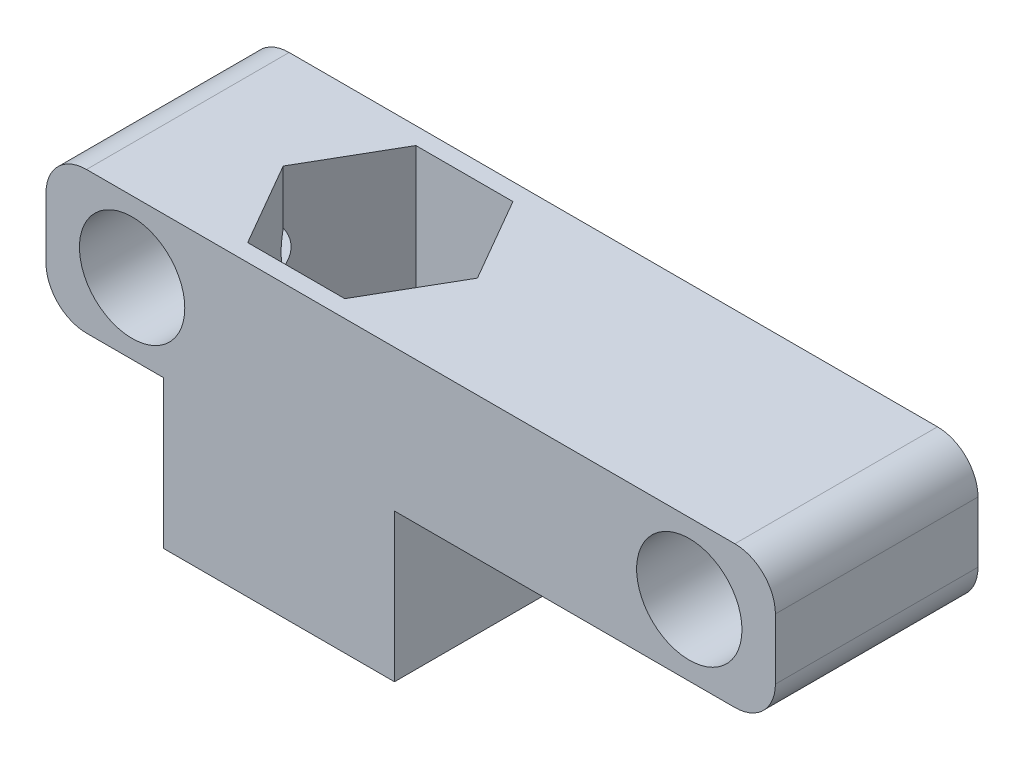
ISO-10303-21;
HEADER;
FILE_DESCRIPTION(('STEP AP214'),'2;1');
FILE_NAME('part.step','',(''),(''),'','','');
FILE_SCHEMA(('AUTOMOTIVE_DESIGN { 1 0 10303 214 1 1 1 1 }'));
ENDSEC;
DATA;
#1=APPLICATION_CONTEXT('core data for automotive mechanical design processes');
#2=APPLICATION_PROTOCOL_DEFINITION('international standard','automotive_design',2000,#1);
#3=PRODUCT_CONTEXT('',#1,'mechanical');
#4=PRODUCT('Part','Part','',(#3));
#5=PRODUCT_RELATED_PRODUCT_CATEGORY('part','',(#4));
#6=PRODUCT_DEFINITION_FORMATION('','',#4);
#7=PRODUCT_DEFINITION_CONTEXT('part definition',#1,'design');
#8=PRODUCT_DEFINITION('design','',#6,#7);
#9=PRODUCT_DEFINITION_SHAPE('','',#8);
#10=(LENGTH_UNIT() NAMED_UNIT(*) SI_UNIT(.MILLI.,.METRE.));
#11=(NAMED_UNIT(*) PLANE_ANGLE_UNIT() SI_UNIT($,.RADIAN.));
#12=(NAMED_UNIT(*) SI_UNIT($,.STERADIAN.) SOLID_ANGLE_UNIT());
#13=UNCERTAINTY_MEASURE_WITH_UNIT(LENGTH_MEASURE(1.E-05),#10,'distance_accuracy_value','');
#14=(GEOMETRIC_REPRESENTATION_CONTEXT(3) GLOBAL_UNCERTAINTY_ASSIGNED_CONTEXT((#13)) GLOBAL_UNIT_ASSIGNED_CONTEXT((#10,
#11,#12)) REPRESENTATION_CONTEXT('',''));
#15=CARTESIAN_POINT('',(0.,0.,0.));
#16=DIRECTION('',(0.,0.,1.));
#17=DIRECTION('',(1.,0.,0.));
#18=AXIS2_PLACEMENT_3D('',#15,#16,#17);
#19=CARTESIAN_POINT('',(-46.016694490818,8.8780487804878,10.));
#20=DIRECTION('',(0.,1.,0.));
#21=DIRECTION('',(0.,0.,1.));
#22=AXIS2_PLACEMENT_3D('',#19,#20,#21);
#23=PLANE('',#22);
#24=DIRECTION('',(1.,0.,0.));
#25=VECTOR('',#24,1.);
#26=CARTESIAN_POINT('',(-46.016694490818,8.8780487804878,10.));
#27=LINE('',#26,#25);
#28=CARTESIAN_POINT('',(-44.016694490818,8.8780487804878,10.));
#29=VERTEX_POINT('',#28);
#30=CARTESIAN_POINT('',(-40.216694490818,8.8780487804878,10.));
#31=VERTEX_POINT('',#30);
#32=EDGE_CURVE('E264',#29,#31,#27,.T.);
#33=ORIENTED_EDGE('',*,*,#32,.F.);
#34=DIRECTION('',(0.,0.,-1.));
#35=VECTOR('',#34,1.);
#36=CARTESIAN_POINT('',(-44.016694490818,8.8780487804878,10.));
#37=LINE('',#36,#35);
#38=CARTESIAN_POINT('',(-44.016694490818,8.8780487804878,0.));
#39=VERTEX_POINT('',#38);
#40=EDGE_CURVE('E286',#29,#39,#37,.T.);
#41=ORIENTED_EDGE('',*,*,#40,.T.);
#42=DIRECTION('',(1.,0.,0.));
#43=VECTOR('',#42,1.);
#44=CARTESIAN_POINT('',(-46.016694490818,8.8780487804878,0.));
#45=LINE('',#44,#43);
#46=CARTESIAN_POINT('',(-40.216694490818,8.8780487804878,0.));
#47=VERTEX_POINT('',#46);
#48=EDGE_CURVE('E244',#39,#47,#45,.T.);
#49=ORIENTED_EDGE('',*,*,#48,.T.);
#50=DIRECTION('',(0.,0.,-1.));
#51=VECTOR('',#50,1.);
#52=CARTESIAN_POINT('',(-40.216694490818,8.8780487804878,10.));
#53=LINE('',#52,#51);
#54=EDGE_CURVE('E173',#31,#47,#53,.T.);
#55=ORIENTED_EDGE('',*,*,#54,.F.);
#56=EDGE_LOOP('',(#33,#41,#49,#55));
#57=FACE_BOUND('',#56,.T.);
#58=ADVANCED_FACE('F33',(#57),#23,.F.);
#59=CARTESIAN_POINT('',(-28.816694490818,8.8780487804878,0.));
#60=VERTEX_POINT('',#59);
#61=CARTESIAN_POINT('',(-12.016694490818,8.8780487804878,0.));
#62=VERTEX_POINT('',#61);
#63=EDGE_CURVE('E248',#60,#62,#45,.T.);
#64=ORIENTED_EDGE('',*,*,#63,.T.);
#65=DIRECTION('',(0.,0.,-1.));
#66=VECTOR('',#65,1.);
#67=CARTESIAN_POINT('',(-12.016694490818,8.8780487804878,10.));
#68=LINE('',#67,#66);
#69=CARTESIAN_POINT('',(-12.016694490818,8.8780487804878,10.));
#70=VERTEX_POINT('',#69);
#71=EDGE_CURVE('E48',#62,#70,#68,.F.);
#72=ORIENTED_EDGE('',*,*,#71,.T.);
#73=CARTESIAN_POINT('',(-28.816694490818,8.8780487804878,10.));
#74=VERTEX_POINT('',#73);
#75=EDGE_CURVE('E261',#74,#70,#27,.T.);
#76=ORIENTED_EDGE('',*,*,#75,.F.);
#77=DIRECTION('',(0.,0.,1.));
#78=VECTOR('',#77,1.);
#79=CARTESIAN_POINT('',(-28.816694490818,8.8780487804878,10.));
#80=LINE('',#79,#78);
#81=EDGE_CURVE('E230',#60,#74,#80,.T.);
#82=ORIENTED_EDGE('',*,*,#81,.F.);
#83=EDGE_LOOP('',(#64,#72,#76,#82));
#84=FACE_BOUND('',#83,.T.);
#85=ADVANCED_FACE('F402',(#84),#23,.F.);
#86=CARTESIAN_POINT('',(0.,0.,10.));
#87=DIRECTION('',(0.,0.,1.));
#88=DIRECTION('',(1.,0.,0.));
#89=AXIS2_PLACEMENT_3D('',#86,#87,#88);
#90=PLANE('',#89);
#91=CARTESIAN_POINT('',(-41.766694490818,12.3780487804878,10.));
#92=DIRECTION('',(0.,0.,1.));
#93=DIRECTION('',(1.,0.,0.));
#94=AXIS2_PLACEMENT_3D('',#91,#92,#93);
#95=CIRCLE('',#94,2.6);
#96=CARTESIAN_POINT('',(-39.166694490818,12.3780487804878,10.));
#97=VERTEX_POINT('',#96);
#98=EDGE_CURVE('E300',#97,#97,#95,.T.);
#99=ORIENTED_EDGE('',*,*,#98,.F.);
#100=EDGE_LOOP('',(#99));
#101=FACE_BOUND('',#100,.T.);
#102=DIRECTION('',(0.,1.,0.));
#103=VECTOR('',#102,1.);
#104=CARTESIAN_POINT('',(-10.016694490818,15.8780487804878,10.));
#105=LINE('',#104,#103);
#106=CARTESIAN_POINT('',(-10.016694490818,10.8780487804878,10.));
#107=VERTEX_POINT('',#106);
#108=CARTESIAN_POINT('',(-10.016694490818,13.8780487804878,10.));
#109=VERTEX_POINT('',#108);
#110=EDGE_CURVE('E271',#107,#109,#105,.T.);
#111=ORIENTED_EDGE('',*,*,#110,.T.);
#112=CARTESIAN_POINT('',(-12.016694490818,13.8780487804878,10.));
#113=DIRECTION('',(0.,0.,1.));
#114=DIRECTION('',(1.,0.,0.));
#115=AXIS2_PLACEMENT_3D('',#112,#113,#114);
#116=CIRCLE('',#115,2.);
#117=CARTESIAN_POINT('',(-12.016694490818,15.8780487804878,10.));
#118=VERTEX_POINT('',#117);
#119=EDGE_CURVE('E283',#109,#118,#116,.T.);
#120=ORIENTED_EDGE('',*,*,#119,.T.);
#121=DIRECTION('',(-1.,0.,0.));
#122=VECTOR('',#121,1.);
#123=CARTESIAN_POINT('',(-46.016694490818,15.8780487804878,10.));
#124=LINE('',#123,#122);
#125=CARTESIAN_POINT('',(-44.016694490818,15.8780487804878,10.));
#126=VERTEX_POINT('',#125);
#127=EDGE_CURVE('E379',#118,#126,#124,.T.);
#128=ORIENTED_EDGE('',*,*,#127,.T.);
#129=CARTESIAN_POINT('',(-44.016694490818,13.8780487804878,10.));
#130=DIRECTION('',(0.,0.,1.));
#131=DIRECTION('',(1.,0.,0.));
#132=AXIS2_PLACEMENT_3D('',#129,#130,#131);
#133=CIRCLE('',#132,2.);
#134=CARTESIAN_POINT('',(-46.016694490818,13.8780487804878,10.));
#135=VERTEX_POINT('',#134);
#136=EDGE_CURVE('E278',#126,#135,#133,.T.);
#137=ORIENTED_EDGE('',*,*,#136,.T.);
#138=DIRECTION('',(0.,-1.,0.));
#139=VECTOR('',#138,1.);
#140=CARTESIAN_POINT('',(-46.016694490818,15.8780487804878,10.));
#141=LINE('',#140,#139);
#142=CARTESIAN_POINT('',(-46.016694490818,10.8780487804878,10.));
#143=VERTEX_POINT('',#142);
#144=EDGE_CURVE('E265',#135,#143,#141,.T.);
#145=ORIENTED_EDGE('',*,*,#144,.T.);
#146=CARTESIAN_POINT('',(-44.016694490818,10.8780487804878,10.));
#147=DIRECTION('',(0.,0.,1.));
#148=DIRECTION('',(1.,0.,0.));
#149=AXIS2_PLACEMENT_3D('',#146,#147,#148);
#150=CIRCLE('',#149,2.);
#151=EDGE_CURVE('E56',#143,#29,#150,.T.);
#152=ORIENTED_EDGE('',*,*,#151,.T.);
#153=ORIENTED_EDGE('',*,*,#32,.T.);
#154=DIRECTION('',(0.,1.,0.));
#155=VECTOR('',#154,1.);
#156=CARTESIAN_POINT('',(-40.216694490818,3.8780487804878,10.));
#157=LINE('',#156,#155);
#158=CARTESIAN_POINT('',(-40.216694490818,1.5780487804878,10.));
#159=VERTEX_POINT('',#158);
#160=EDGE_CURVE('E232',#159,#31,#157,.T.);
#161=ORIENTED_EDGE('',*,*,#160,.F.);
#162=DIRECTION('',(-1.,0.,0.));
#163=VECTOR('',#162,1.);
#164=CARTESIAN_POINT('',(-40.216694490818,1.5780487804878,10.));
#165=LINE('',#164,#163);
#166=CARTESIAN_POINT('',(-28.816694490818,1.5780487804878,10.));
#167=VERTEX_POINT('',#166);
#168=EDGE_CURVE('E195',#167,#159,#165,.T.);
#169=ORIENTED_EDGE('',*,*,#168,.F.);
#170=DIRECTION('',(0.,1.,0.));
#171=VECTOR('',#170,1.);
#172=CARTESIAN_POINT('',(-28.816694490818,3.8780487804878,10.));
#173=LINE('',#172,#171);
#174=EDGE_CURVE('E234',#167,#74,#173,.T.);
#175=ORIENTED_EDGE('',*,*,#174,.T.);
#176=ORIENTED_EDGE('',*,*,#75,.T.);
#177=CARTESIAN_POINT('',(-12.016694490818,10.8780487804878,10.));
#178=DIRECTION('',(0.,0.,1.));
#179=DIRECTION('',(1.,0.,0.));
#180=AXIS2_PLACEMENT_3D('',#177,#178,#179);
#181=CIRCLE('',#180,2.);
#182=EDGE_CURVE('E281',#70,#107,#181,.T.);
#183=ORIENTED_EDGE('',*,*,#182,.T.);
#184=EDGE_LOOP('',(#111,#120,#128,#137,#145,#152,#153,#161,#169,#175,#176,#183));
#185=FACE_BOUND('',#184,.T.);
#186=CARTESIAN_POINT('',(-14.266694490818,12.3780487804878,10.));
#187=DIRECTION('',(0.,0.,1.));
#188=DIRECTION('',(1.,0.,0.));
#189=AXIS2_PLACEMENT_3D('',#186,#187,#188);
#190=CIRCLE('',#189,2.6);
#191=CARTESIAN_POINT('',(-11.666694490818,12.3780487804878,10.));
#192=VERTEX_POINT('',#191);
#193=EDGE_CURVE('E307',#192,#192,#190,.T.);
#194=ORIENTED_EDGE('',*,*,#193,.F.);
#195=EDGE_LOOP('',(#194));
#196=FACE_BOUND('',#195,.T.);
#197=ADVANCED_FACE('F406',(#101,#185,#196),#90,.T.);
#198=CARTESIAN_POINT('',(0.,0.,0.));
#199=DIRECTION('',(0.,0.,1.));
#200=DIRECTION('',(1.,0.,0.));
#201=AXIS2_PLACEMENT_3D('',#198,#199,#200);
#202=PLANE('',#201);
#203=DIRECTION('',(-1.,0.,0.));
#204=VECTOR('',#203,1.);
#205=CARTESIAN_POINT('',(-46.016694490818,15.8780487804878,0.));
#206=LINE('',#205,#204);
#207=CARTESIAN_POINT('',(-12.016694490818,15.8780487804878,0.));
#208=VERTEX_POINT('',#207);
#209=CARTESIAN_POINT('',(-44.016694490818,15.8780487804878,0.));
#210=VERTEX_POINT('',#209);
#211=EDGE_CURVE('E381',#208,#210,#206,.T.);
#212=ORIENTED_EDGE('',*,*,#211,.F.);
#213=CARTESIAN_POINT('',(-12.016694490818,13.8780487804878,0.));
#214=DIRECTION('',(0.,0.,1.));
#215=DIRECTION('',(1.,0.,0.));
#216=AXIS2_PLACEMENT_3D('',#213,#214,#215);
#217=CIRCLE('',#216,2.);
#218=CARTESIAN_POINT('',(-10.016694490818,13.8780487804878,0.));
#219=VERTEX_POINT('',#218);
#220=EDGE_CURVE('E397',#208,#219,#217,.F.);
#221=ORIENTED_EDGE('',*,*,#220,.T.);
#222=DIRECTION('',(0.,1.,0.));
#223=VECTOR('',#222,1.);
#224=CARTESIAN_POINT('',(-10.016694490818,15.8780487804878,0.));
#225=LINE('',#224,#223);
#226=CARTESIAN_POINT('',(-10.016694490818,10.8780487804878,0.));
#227=VERTEX_POINT('',#226);
#228=EDGE_CURVE('E247',#227,#219,#225,.T.);
#229=ORIENTED_EDGE('',*,*,#228,.F.);
#230=CARTESIAN_POINT('',(-12.016694490818,10.8780487804878,0.));
#231=DIRECTION('',(0.,0.,1.));
#232=DIRECTION('',(1.,0.,0.));
#233=AXIS2_PLACEMENT_3D('',#230,#231,#232);
#234=CIRCLE('',#233,2.);
#235=EDGE_CURVE('E398',#227,#62,#234,.F.);
#236=ORIENTED_EDGE('',*,*,#235,.T.);
#237=ORIENTED_EDGE('',*,*,#63,.F.);
#238=DIRECTION('',(0.,1.,0.));
#239=VECTOR('',#238,1.);
#240=CARTESIAN_POINT('',(-28.816694490818,3.8780487804878,0.));
#241=LINE('',#240,#239);
#242=CARTESIAN_POINT('',(-28.816694490818,1.5780487804878,0.));
#243=VERTEX_POINT('',#242);
#244=EDGE_CURVE('E177',#243,#60,#241,.T.);
#245=ORIENTED_EDGE('',*,*,#244,.F.);
#246=DIRECTION('',(1.,0.,0.));
#247=VECTOR('',#246,1.);
#248=CARTESIAN_POINT('',(-40.216694490818,1.5780487804878,0.));
#249=LINE('',#248,#247);
#250=CARTESIAN_POINT('',(-40.216694490818,1.5780487804878,0.));
#251=VERTEX_POINT('',#250);
#252=EDGE_CURVE('E180',#251,#243,#249,.T.);
#253=ORIENTED_EDGE('',*,*,#252,.F.);
#254=DIRECTION('',(0.,1.,0.));
#255=VECTOR('',#254,1.);
#256=CARTESIAN_POINT('',(-40.216694490818,3.8780487804878,0.));
#257=LINE('',#256,#255);
#258=EDGE_CURVE('E166',#251,#47,#257,.T.);
#259=ORIENTED_EDGE('',*,*,#258,.T.);
#260=ORIENTED_EDGE('',*,*,#48,.F.);
#261=CARTESIAN_POINT('',(-44.016694490818,10.8780487804878,0.));
#262=DIRECTION('',(0.,0.,1.));
#263=DIRECTION('',(1.,0.,0.));
#264=AXIS2_PLACEMENT_3D('',#261,#262,#263);
#265=CIRCLE('',#264,2.);
#266=CARTESIAN_POINT('',(-46.016694490818,10.8780487804878,0.));
#267=VERTEX_POINT('',#266);
#268=EDGE_CURVE('E299',#39,#267,#265,.F.);
#269=ORIENTED_EDGE('',*,*,#268,.T.);
#270=DIRECTION('',(0.,-1.,0.));
#271=VECTOR('',#270,1.);
#272=CARTESIAN_POINT('',(-46.016694490818,15.8780487804878,0.));
#273=LINE('',#272,#271);
#274=CARTESIAN_POINT('',(-46.016694490818,13.8780487804878,0.));
#275=VERTEX_POINT('',#274);
#276=EDGE_CURVE('E253',#275,#267,#273,.T.);
#277=ORIENTED_EDGE('',*,*,#276,.F.);
#278=CARTESIAN_POINT('',(-44.016694490818,13.8780487804878,0.));
#279=DIRECTION('',(0.,0.,1.));
#280=DIRECTION('',(1.,0.,0.));
#281=AXIS2_PLACEMENT_3D('',#278,#279,#280);
#282=CIRCLE('',#281,2.);
#283=EDGE_CURVE('E243',#275,#210,#282,.F.);
#284=ORIENTED_EDGE('',*,*,#283,.T.);
#285=EDGE_LOOP('',(#212,#221,#229,#236,#237,#245,#253,#259,#260,#269,#277,#284));
#286=FACE_BOUND('',#285,.T.);
#287=CARTESIAN_POINT('',(-41.766694490818,12.3780487804878,0.));
#288=DIRECTION('',(0.,0.,1.));
#289=DIRECTION('',(1.,0.,0.));
#290=AXIS2_PLACEMENT_3D('',#287,#288,#289);
#291=CIRCLE('',#290,2.6);
#292=CARTESIAN_POINT('',(-39.166694490818,12.3780487804878,0.));
#293=VERTEX_POINT('',#292);
#294=EDGE_CURVE('E302',#293,#293,#291,.T.);
#295=ORIENTED_EDGE('',*,*,#294,.T.);
#296=EDGE_LOOP('',(#295));
#297=FACE_BOUND('',#296,.T.);
#298=CARTESIAN_POINT('',(-14.266694490818,12.3780487804878,0.));
#299=DIRECTION('',(0.,0.,1.));
#300=DIRECTION('',(1.,0.,0.));
#301=AXIS2_PLACEMENT_3D('',#298,#299,#300);
#302=CIRCLE('',#301,2.6);
#303=CARTESIAN_POINT('',(-11.666694490818,12.3780487804878,0.));
#304=VERTEX_POINT('',#303);
#305=EDGE_CURVE('E309',#304,#304,#302,.T.);
#306=ORIENTED_EDGE('',*,*,#305,.T.);
#307=EDGE_LOOP('',(#306));
#308=FACE_BOUND('',#307,.T.);
#309=ADVANCED_FACE('F182',(#286,#297,#308),#202,.F.);
#310=CARTESIAN_POINT('',(-46.016694490818,15.8780487804878,10.));
#311=DIRECTION('',(1.,0.,0.));
#312=DIRECTION('',(0.,0.,-1.));
#313=AXIS2_PLACEMENT_3D('',#310,#311,#312);
#314=PLANE('',#313);
#315=ORIENTED_EDGE('',*,*,#276,.T.);
#316=DIRECTION('',(0.,0.,-1.));
#317=VECTOR('',#316,1.);
#318=CARTESIAN_POINT('',(-46.016694490818,10.8780487804878,10.));
#319=LINE('',#318,#317);
#320=EDGE_CURVE('E11',#267,#143,#319,.F.);
#321=ORIENTED_EDGE('',*,*,#320,.T.);
#322=ORIENTED_EDGE('',*,*,#144,.F.);
#323=DIRECTION('',(0.,0.,-1.));
#324=VECTOR('',#323,1.);
#325=CARTESIAN_POINT('',(-46.016694490818,13.8780487804878,10.));
#326=LINE('',#325,#324);
#327=EDGE_CURVE('E41',#135,#275,#326,.T.);
#328=ORIENTED_EDGE('',*,*,#327,.T.);
#329=EDGE_LOOP('',(#315,#321,#322,#328));
#330=FACE_BOUND('',#329,.T.);
#331=ADVANCED_FACE('F294',(#330),#314,.F.);
#332=CARTESIAN_POINT('',(-10.016694490818,15.8780487804878,10.));
#333=DIRECTION('',(-1.,0.,0.));
#334=DIRECTION('',(0.,-1.,0.));
#335=AXIS2_PLACEMENT_3D('',#332,#333,#334);
#336=PLANE('',#335);
#337=ORIENTED_EDGE('',*,*,#228,.T.);
#338=DIRECTION('',(0.,0.,-1.));
#339=VECTOR('',#338,1.);
#340=CARTESIAN_POINT('',(-10.016694490818,13.8780487804878,10.));
#341=LINE('',#340,#339);
#342=EDGE_CURVE('E276',#219,#109,#341,.F.);
#343=ORIENTED_EDGE('',*,*,#342,.T.);
#344=ORIENTED_EDGE('',*,*,#110,.F.);
#345=DIRECTION('',(0.,0.,-1.));
#346=VECTOR('',#345,1.);
#347=CARTESIAN_POINT('',(-10.016694490818,10.8780487804878,10.));
#348=LINE('',#347,#346);
#349=EDGE_CURVE('E392',#107,#227,#348,.T.);
#350=ORIENTED_EDGE('',*,*,#349,.T.);
#351=EDGE_LOOP('',(#337,#343,#344,#350));
#352=FACE_BOUND('',#351,.T.);
#353=ADVANCED_FACE('F388',(#352),#336,.F.);
#354=CARTESIAN_POINT('',(-46.016694490818,15.8780487804878,10.));
#355=DIRECTION('',(0.,-1.,0.));
#356=DIRECTION('',(0.,0.,-1.));
#357=AXIS2_PLACEMENT_3D('',#354,#355,#356);
#358=PLANE('',#357);
#359=DIRECTION('',(1.,0.,0.));
#360=VECTOR('',#359,1.);
#361=CARTESIAN_POINT('',(-36.912698107955,15.8780487804878,0.849999999999997));
#362=LINE('',#361,#360);
#363=CARTESIAN_POINT('',(-36.912698107955,15.8780487804878,0.849999999999997));
#364=VERTEX_POINT('',#363);
#365=CARTESIAN_POINT('',(-32.1206908736811,15.8780487804878,0.849999999999996));
#366=VERTEX_POINT('',#365);
#367=EDGE_CURVE('E319',#364,#366,#362,.T.);
#368=ORIENTED_EDGE('',*,*,#367,.T.);
#369=DIRECTION('',(0.5,0.,0.866025403784439));
#370=VECTOR('',#369,1.);
#371=CARTESIAN_POINT('',(-32.1206908736811,15.8780487804878,0.849999999999996));
#372=LINE('',#371,#370);
#373=CARTESIAN_POINT('',(-29.7246872565441,15.8780487804878,5.00000000000001));
#374=VERTEX_POINT('',#373);
#375=EDGE_CURVE('E176',#366,#374,#372,.T.);
#376=ORIENTED_EDGE('',*,*,#375,.T.);
#377=DIRECTION('',(-0.5,0.,0.866025403784439));
#378=VECTOR('',#377,1.);
#379=CARTESIAN_POINT('',(-29.7246872565441,15.8780487804878,5.00000000000001));
#380=LINE('',#379,#378);
#381=CARTESIAN_POINT('',(-32.1206908736811,15.8780487804878,9.15));
#382=VERTEX_POINT('',#381);
#383=EDGE_CURVE('E345',#374,#382,#380,.T.);
#384=ORIENTED_EDGE('',*,*,#383,.T.);
#385=DIRECTION('',(-1.,0.,0.));
#386=VECTOR('',#385,1.);
#387=CARTESIAN_POINT('',(-32.1206908736811,15.8780487804878,9.15));
#388=LINE('',#387,#386);
#389=CARTESIAN_POINT('',(-36.912698107955,15.8780487804878,9.15));
#390=VERTEX_POINT('',#389);
#391=EDGE_CURVE('E342',#382,#390,#388,.T.);
#392=ORIENTED_EDGE('',*,*,#391,.T.);
#393=DIRECTION('',(-0.5,0.,-0.866025403784439));
#394=VECTOR('',#393,1.);
#395=CARTESIAN_POINT('',(-36.912698107955,15.8780487804878,9.15));
#396=LINE('',#395,#394);
#397=CARTESIAN_POINT('',(-39.3087017250919,15.8780487804878,4.99999999999999));
#398=VERTEX_POINT('',#397);
#399=EDGE_CURVE('E339',#390,#398,#396,.T.);
#400=ORIENTED_EDGE('',*,*,#399,.T.);
#401=DIRECTION('',(0.5,0.,-0.866025403784438));
#402=VECTOR('',#401,1.);
#403=CARTESIAN_POINT('',(-39.3087017250919,15.8780487804878,4.99999999999999));
#404=LINE('',#403,#402);
#405=EDGE_CURVE('E336',#398,#364,#404,.T.);
#406=ORIENTED_EDGE('',*,*,#405,.T.);
#407=EDGE_LOOP('',(#368,#376,#384,#392,#400,#406));
#408=FACE_BOUND('',#407,.T.);
#409=ORIENTED_EDGE('',*,*,#127,.F.);
#410=DIRECTION('',(0.,0.,-1.));
#411=VECTOR('',#410,1.);
#412=CARTESIAN_POINT('',(-12.016694490818,15.8780487804878,10.));
#413=LINE('',#412,#411);
#414=EDGE_CURVE('E239',#118,#208,#413,.T.);
#415=ORIENTED_EDGE('',*,*,#414,.T.);
#416=ORIENTED_EDGE('',*,*,#211,.T.);
#417=DIRECTION('',(0.,0.,-1.));
#418=VECTOR('',#417,1.);
#419=CARTESIAN_POINT('',(-44.016694490818,15.8780487804878,10.));
#420=LINE('',#419,#418);
#421=EDGE_CURVE('E237',#210,#126,#420,.F.);
#422=ORIENTED_EDGE('',*,*,#421,.T.);
#423=EDGE_LOOP('',(#409,#415,#416,#422));
#424=FACE_BOUND('',#423,.T.);
#425=ADVANCED_FACE('F350',(#408,#424),#358,.F.);
#426=CARTESIAN_POINT('',(-41.766694490818,12.3780487804878,10.));
#427=DIRECTION('',(0.,0.,-1.));
#428=DIRECTION('',(-1.,0.,0.));
#429=AXIS2_PLACEMENT_3D('',#426,#427,#428);
#430=CYLINDRICAL_SURFACE('',#429,2.6);
#431=CARTESIAN_POINT('',(-41.766694490818,12.3780487804878,9.25736835487436));
#432=DIRECTION('',(-0.866025403784438,0.,-0.5));
#433=DIRECTION('',(0.5,0.,-0.866025403784439));
#434=AXIS2_PLACEMENT_3D('',#431,#432,#433);
#435=ELLIPSE('',#434,5.19999999999999,2.6);
#436=CARTESIAN_POINT('',(-39.3087017250919,13.2255578150344,4.99999999999999));
#437=VERTEX_POINT('',#436);
#438=CARTESIAN_POINT('',(-39.3087017250919,11.5305397459412,4.99999999999999));
#439=VERTEX_POINT('',#438);
#440=EDGE_CURVE('E240',#437,#439,#435,.T.);
#441=ORIENTED_EDGE('',*,*,#440,.F.);
#442=CARTESIAN_POINT('',(-41.766694490818,12.3780487804878,0.742631645125618));
#443=DIRECTION('',(-0.866025403784439,0.,0.5));
#444=DIRECTION('',(-0.5,0.,-0.866025403784439));
#445=AXIS2_PLACEMENT_3D('',#442,#443,#444);
#446=ELLIPSE('',#445,5.2,2.6);
#447=EDGE_CURVE('E366',#439,#437,#446,.T.);
#448=ORIENTED_EDGE('',*,*,#447,.F.);
#449=EDGE_LOOP('',(#441,#448));
#450=FACE_BOUND('',#449,.T.);
#451=ORIENTED_EDGE('',*,*,#98,.T.);
#452=EDGE_LOOP('',(#451));
#453=FACE_BOUND('',#452,.T.);
#454=ORIENTED_EDGE('',*,*,#294,.F.);
#455=EDGE_LOOP('',(#454));
#456=FACE_BOUND('',#455,.T.);
#457=ADVANCED_FACE('F378',(#450,#453,#456),#430,.F.);
#458=CARTESIAN_POINT('',(-14.266694490818,12.3780487804878,10.));
#459=DIRECTION('',(0.,0.,-1.));
#460=DIRECTION('',(-1.,0.,0.));
#461=AXIS2_PLACEMENT_3D('',#458,#459,#460);
#462=CYLINDRICAL_SURFACE('',#461,2.6);
#463=ORIENTED_EDGE('',*,*,#193,.T.);
#464=EDGE_LOOP('',(#463));
#465=FACE_BOUND('',#464,.T.);
#466=ORIENTED_EDGE('',*,*,#305,.F.);
#467=EDGE_LOOP('',(#466));
#468=FACE_BOUND('',#467,.T.);
#469=ADVANCED_FACE('F427',(#465,#468),#462,.F.);
#470=CARTESIAN_POINT('',(-32.1206908736811,15.8780487804878,0.849999999999996));
#471=DIRECTION('',(0.866025403784439,0.,-0.5));
#472=DIRECTION('',(-0.5,0.,-0.866025403784439));
#473=AXIS2_PLACEMENT_3D('',#470,#471,#472);
#474=PLANE('',#473);
#475=DIRECTION('',(0.,-1.,0.));
#476=VECTOR('',#475,1.);
#477=CARTESIAN_POINT('',(-32.1206908736811,15.8780487804878,0.849999999999996));
#478=LINE('',#477,#476);
#479=CARTESIAN_POINT('',(-32.120690873681,3.8780487804878,0.85));
#480=VERTEX_POINT('',#479);
#481=EDGE_CURVE('E312',#366,#480,#478,.T.);
#482=ORIENTED_EDGE('',*,*,#481,.T.);
#483=DIRECTION('',(0.5,0.,0.866025403784439));
#484=VECTOR('',#483,1.);
#485=CARTESIAN_POINT('',(-32.120690873681,3.8780487804878,0.85));
#486=LINE('',#485,#484);
#487=CARTESIAN_POINT('',(-29.7246872565441,3.8780487804878,5.));
#488=VERTEX_POINT('',#487);
#489=EDGE_CURVE('E205',#480,#488,#486,.T.);
#490=ORIENTED_EDGE('',*,*,#489,.T.);
#491=DIRECTION('',(0.,-1.,0.));
#492=VECTOR('',#491,1.);
#493=CARTESIAN_POINT('',(-29.7246872565441,15.8780487804878,5.00000000000001));
#494=LINE('',#493,#492);
#495=EDGE_CURVE('E315',#374,#488,#494,.T.);
#496=ORIENTED_EDGE('',*,*,#495,.F.);
#497=ORIENTED_EDGE('',*,*,#375,.F.);
#498=EDGE_LOOP('',(#482,#490,#496,#497));
#499=FACE_BOUND('',#498,.T.);
#500=ADVANCED_FACE('F355',(#499),#474,.F.);
#501=CARTESIAN_POINT('',(-36.912698107955,15.8780487804878,0.849999999999997));
#502=DIRECTION('',(0.,0.,-1.));
#503=DIRECTION('',(-1.,0.,0.));
#504=AXIS2_PLACEMENT_3D('',#501,#502,#503);
#505=PLANE('',#504);
#506=DIRECTION('',(0.,-1.,0.));
#507=VECTOR('',#506,1.);
#508=CARTESIAN_POINT('',(-36.912698107955,15.8780487804878,0.849999999999997));
#509=LINE('',#508,#507);
#510=CARTESIAN_POINT('',(-36.9126981079549,3.8780487804878,0.850000000000001));
#511=VERTEX_POINT('',#510);
#512=EDGE_CURVE('E329',#364,#511,#509,.T.);
#513=ORIENTED_EDGE('',*,*,#512,.T.);
#514=DIRECTION('',(1.,0.,0.));
#515=VECTOR('',#514,1.);
#516=CARTESIAN_POINT('',(-36.9126981079549,3.8780487804878,0.850000000000001));
#517=LINE('',#516,#515);
#518=EDGE_CURVE('E220',#511,#480,#517,.T.);
#519=ORIENTED_EDGE('',*,*,#518,.T.);
#520=ORIENTED_EDGE('',*,*,#481,.F.);
#521=ORIENTED_EDGE('',*,*,#367,.F.);
#522=EDGE_LOOP('',(#513,#519,#520,#521));
#523=FACE_BOUND('',#522,.T.);
#524=ADVANCED_FACE('F373',(#523),#505,.F.);
#525=CARTESIAN_POINT('',(-39.3087017250919,15.8780487804878,4.99999999999999));
#526=DIRECTION('',(-0.866025403784438,0.,-0.5));
#527=DIRECTION('',(-0.5,0.,0.866025403784439));
#528=AXIS2_PLACEMENT_3D('',#525,#526,#527);
#529=PLANE('',#528);
#530=ORIENTED_EDGE('',*,*,#440,.T.);
#531=DIRECTION('',(0.,-1.,0.));
#532=VECTOR('',#531,1.);
#533=CARTESIAN_POINT('',(-39.3087017250919,15.8780487804878,4.99999999999999));
#534=LINE('',#533,#532);
#535=CARTESIAN_POINT('',(-39.3087017250919,3.8780487804878,4.99999999999999));
#536=VERTEX_POINT('',#535);
#537=EDGE_CURVE('E325',#439,#536,#534,.T.);
#538=ORIENTED_EDGE('',*,*,#537,.T.);
#539=DIRECTION('',(0.5,0.,-0.866025403784438));
#540=VECTOR('',#539,1.);
#541=CARTESIAN_POINT('',(-39.3087017250919,3.8780487804878,4.99999999999999));
#542=LINE('',#541,#540);
#543=EDGE_CURVE('E217',#536,#511,#542,.T.);
#544=ORIENTED_EDGE('',*,*,#543,.T.);
#545=ORIENTED_EDGE('',*,*,#512,.F.);
#546=ORIENTED_EDGE('',*,*,#405,.F.);
#547=EDGE_CURVE('E326',#398,#437,#534,.T.);
#548=ORIENTED_EDGE('',*,*,#547,.T.);
#549=EDGE_LOOP('',(#530,#538,#544,#545,#546,#548));
#550=FACE_BOUND('',#549,.T.);
#551=ADVANCED_FACE('F370',(#550),#529,.F.);
#552=CARTESIAN_POINT('',(-36.912698107955,15.8780487804878,9.15));
#553=DIRECTION('',(-0.866025403784439,0.,0.5));
#554=DIRECTION('',(0.5,0.,0.866025403784439));
#555=AXIS2_PLACEMENT_3D('',#552,#553,#554);
#556=PLANE('',#555);
#557=ORIENTED_EDGE('',*,*,#447,.T.);
#558=ORIENTED_EDGE('',*,*,#547,.F.);
#559=ORIENTED_EDGE('',*,*,#399,.F.);
#560=DIRECTION('',(0.,-1.,0.));
#561=VECTOR('',#560,1.);
#562=CARTESIAN_POINT('',(-36.912698107955,15.8780487804878,9.15));
#563=LINE('',#562,#561);
#564=CARTESIAN_POINT('',(-36.9126981079549,3.8780487804878,9.15));
#565=VERTEX_POINT('',#564);
#566=EDGE_CURVE('E322',#390,#565,#563,.T.);
#567=ORIENTED_EDGE('',*,*,#566,.T.);
#568=DIRECTION('',(-0.5,0.,-0.866025403784439));
#569=VECTOR('',#568,1.);
#570=CARTESIAN_POINT('',(-36.9126981079549,3.8780487804878,9.15));
#571=LINE('',#570,#569);
#572=EDGE_CURVE('E214',#565,#536,#571,.T.);
#573=ORIENTED_EDGE('',*,*,#572,.T.);
#574=ORIENTED_EDGE('',*,*,#537,.F.);
#575=EDGE_LOOP('',(#557,#558,#559,#567,#573,#574));
#576=FACE_BOUND('',#575,.T.);
#577=ADVANCED_FACE('F364',(#576),#556,.F.);
#578=CARTESIAN_POINT('',(-32.1206908736811,15.8780487804878,9.15));
#579=DIRECTION('',(0.,0.,1.));
#580=DIRECTION('',(1.,0.,0.));
#581=AXIS2_PLACEMENT_3D('',#578,#579,#580);
#582=PLANE('',#581);
#583=DIRECTION('',(0.,-1.,0.));
#584=VECTOR('',#583,1.);
#585=CARTESIAN_POINT('',(-32.1206908736811,15.8780487804878,9.15));
#586=LINE('',#585,#584);
#587=CARTESIAN_POINT('',(-32.120690873681,3.8780487804878,9.15));
#588=VERTEX_POINT('',#587);
#589=EDGE_CURVE('E318',#382,#588,#586,.T.);
#590=ORIENTED_EDGE('',*,*,#589,.T.);
#591=DIRECTION('',(-1.,0.,0.));
#592=VECTOR('',#591,1.);
#593=CARTESIAN_POINT('',(-32.120690873681,3.8780487804878,9.15));
#594=LINE('',#593,#592);
#595=EDGE_CURVE('E211',#588,#565,#594,.T.);
#596=ORIENTED_EDGE('',*,*,#595,.T.);
#597=ORIENTED_EDGE('',*,*,#566,.F.);
#598=ORIENTED_EDGE('',*,*,#391,.F.);
#599=EDGE_LOOP('',(#590,#596,#597,#598));
#600=FACE_BOUND('',#599,.T.);
#601=ADVANCED_FACE('F360',(#600),#582,.F.);
#602=CARTESIAN_POINT('',(-29.7246872565441,15.8780487804878,5.00000000000001));
#603=DIRECTION('',(0.866025403784439,0.,0.5));
#604=DIRECTION('',(0.5,0.,-0.866025403784439));
#605=AXIS2_PLACEMENT_3D('',#602,#603,#604);
#606=PLANE('',#605);
#607=ORIENTED_EDGE('',*,*,#495,.T.);
#608=DIRECTION('',(-0.5,0.,0.866025403784439));
#609=VECTOR('',#608,1.);
#610=CARTESIAN_POINT('',(-29.7246872565441,3.8780487804878,5.));
#611=LINE('',#610,#609);
#612=EDGE_CURVE('E208',#488,#588,#611,.T.);
#613=ORIENTED_EDGE('',*,*,#612,.T.);
#614=ORIENTED_EDGE('',*,*,#589,.F.);
#615=ORIENTED_EDGE('',*,*,#383,.F.);
#616=EDGE_LOOP('',(#607,#613,#614,#615));
#617=FACE_BOUND('',#616,.T.);
#618=ADVANCED_FACE('F358',(#617),#606,.F.);
#619=CARTESIAN_POINT('',(-40.216694490818,3.8780487804878,10.));
#620=DIRECTION('',(1.,0.,0.));
#621=DIRECTION('',(0.,0.,-1.));
#622=AXIS2_PLACEMENT_3D('',#619,#620,#621);
#623=PLANE('',#622);
#624=ORIENTED_EDGE('',*,*,#54,.T.);
#625=ORIENTED_EDGE('',*,*,#258,.F.);
#626=DIRECTION('',(0.,0.,-1.));
#627=VECTOR('',#626,1.);
#628=CARTESIAN_POINT('',(-40.216694490818,1.5780487804878,10.));
#629=LINE('',#628,#627);
#630=EDGE_CURVE('E171',#159,#251,#629,.T.);
#631=ORIENTED_EDGE('',*,*,#630,.F.);
#632=ORIENTED_EDGE('',*,*,#160,.T.);
#633=EDGE_LOOP('',(#624,#625,#631,#632));
#634=FACE_BOUND('',#633,.T.);
#635=ADVANCED_FACE('F168',(#634),#623,.F.);
#636=CARTESIAN_POINT('',(-28.816694490818,3.8780487804878,10.));
#637=DIRECTION('',(-1.,0.,0.));
#638=DIRECTION('',(0.,0.,1.));
#639=AXIS2_PLACEMENT_3D('',#636,#637,#638);
#640=PLANE('',#639);
#641=ORIENTED_EDGE('',*,*,#81,.T.);
#642=ORIENTED_EDGE('',*,*,#174,.F.);
#643=DIRECTION('',(0.,0.,1.));
#644=VECTOR('',#643,1.);
#645=CARTESIAN_POINT('',(-28.816694490818,1.5780487804878,10.));
#646=LINE('',#645,#644);
#647=EDGE_CURVE('E189',#243,#167,#646,.T.);
#648=ORIENTED_EDGE('',*,*,#647,.F.);
#649=ORIENTED_EDGE('',*,*,#244,.T.);
#650=EDGE_LOOP('',(#641,#642,#648,#649));
#651=FACE_BOUND('',#650,.T.);
#652=ADVANCED_FACE('F410',(#651),#640,.F.);
#653=CARTESIAN_POINT('',(-12.016694490818,13.8780487804878,10.));
#654=DIRECTION('',(0.,0.,-1.));
#655=DIRECTION('',(-1.,0.,0.));
#656=AXIS2_PLACEMENT_3D('',#653,#654,#655);
#657=CYLINDRICAL_SURFACE('',#656,2.);
#658=ORIENTED_EDGE('',*,*,#119,.F.);
#659=ORIENTED_EDGE('',*,*,#342,.F.);
#660=ORIENTED_EDGE('',*,*,#220,.F.);
#661=ORIENTED_EDGE('',*,*,#414,.F.);
#662=EDGE_LOOP('',(#658,#659,#660,#661));
#663=FACE_BOUND('',#662,.T.);
#664=ADVANCED_FACE('F395',(#663),#657,.T.);
#665=CARTESIAN_POINT('',(-12.016694490818,10.8780487804878,10.));
#666=DIRECTION('',(0.,0.,-1.));
#667=DIRECTION('',(-1.,0.,0.));
#668=AXIS2_PLACEMENT_3D('',#665,#666,#667);
#669=CYLINDRICAL_SURFACE('',#668,2.);
#670=ORIENTED_EDGE('',*,*,#182,.F.);
#671=ORIENTED_EDGE('',*,*,#71,.F.);
#672=ORIENTED_EDGE('',*,*,#235,.F.);
#673=ORIENTED_EDGE('',*,*,#349,.F.);
#674=EDGE_LOOP('',(#670,#671,#672,#673));
#675=FACE_BOUND('',#674,.T.);
#676=ADVANCED_FACE('F405',(#675),#669,.T.);
#677=CARTESIAN_POINT('',(-44.016694490818,10.8780487804878,10.));
#678=DIRECTION('',(0.,0.,-1.));
#679=DIRECTION('',(-1.,0.,0.));
#680=AXIS2_PLACEMENT_3D('',#677,#678,#679);
#681=CYLINDRICAL_SURFACE('',#680,2.);
#682=ORIENTED_EDGE('',*,*,#151,.F.);
#683=ORIENTED_EDGE('',*,*,#320,.F.);
#684=ORIENTED_EDGE('',*,*,#268,.F.);
#685=ORIENTED_EDGE('',*,*,#40,.F.);
#686=EDGE_LOOP('',(#682,#683,#684,#685));
#687=FACE_BOUND('',#686,.T.);
#688=ADVANCED_FACE('F419',(#687),#681,.T.);
#689=CARTESIAN_POINT('',(-44.016694490818,13.8780487804878,10.));
#690=DIRECTION('',(0.,0.,-1.));
#691=DIRECTION('',(-1.,0.,0.));
#692=AXIS2_PLACEMENT_3D('',#689,#690,#691);
#693=CYLINDRICAL_SURFACE('',#692,2.);
#694=ORIENTED_EDGE('',*,*,#136,.F.);
#695=ORIENTED_EDGE('',*,*,#421,.F.);
#696=ORIENTED_EDGE('',*,*,#283,.F.);
#697=ORIENTED_EDGE('',*,*,#327,.F.);
#698=EDGE_LOOP('',(#694,#695,#696,#697));
#699=FACE_BOUND('',#698,.T.);
#700=ADVANCED_FACE('F35',(#699),#693,.T.);
#701=CARTESIAN_POINT('',(0.,1.5780487804878,0.));
#702=DIRECTION('',(0.,-1.,0.));
#703=DIRECTION('',(0.,0.,-1.));
#704=AXIS2_PLACEMENT_3D('',#701,#702,#703);
#705=PLANE('',#704);
#706=ORIENTED_EDGE('',*,*,#630,.T.);
#707=ORIENTED_EDGE('',*,*,#252,.T.);
#708=ORIENTED_EDGE('',*,*,#647,.T.);
#709=ORIENTED_EDGE('',*,*,#168,.T.);
#710=EDGE_LOOP('',(#706,#707,#708,#709));
#711=FACE_BOUND('',#710,.T.);
#712=CARTESIAN_POINT('',(-34.516694490818,1.5780487804878,5.));
#713=DIRECTION('',(0.,-1.,0.));
#714=DIRECTION('',(0.,0.,-1.));
#715=AXIS2_PLACEMENT_3D('',#712,#713,#714);
#716=CIRCLE('',#715,3.25);
#717=CARTESIAN_POINT('',(-34.516694490818,1.5780487804878,1.75));
#718=VERTEX_POINT('',#717);
#719=EDGE_CURVE('E196',#718,#718,#716,.T.);
#720=ORIENTED_EDGE('',*,*,#719,.F.);
#721=EDGE_LOOP('',(#720));
#722=FACE_BOUND('',#721,.T.);
#723=ADVANCED_FACE('F192',(#711,#722),#705,.T.);
#724=CARTESIAN_POINT('',(0.,3.8780487804878,0.));
#725=DIRECTION('',(0.,-1.,0.));
#726=DIRECTION('',(0.,0.,-1.));
#727=AXIS2_PLACEMENT_3D('',#724,#725,#726);
#728=PLANE('',#727);
#729=ORIENTED_EDGE('',*,*,#612,.F.);
#730=ORIENTED_EDGE('',*,*,#489,.F.);
#731=ORIENTED_EDGE('',*,*,#518,.F.);
#732=ORIENTED_EDGE('',*,*,#543,.F.);
#733=ORIENTED_EDGE('',*,*,#572,.F.);
#734=ORIENTED_EDGE('',*,*,#595,.F.);
#735=EDGE_LOOP('',(#729,#730,#731,#732,#733,#734));
#736=FACE_BOUND('',#735,.T.);
#737=CARTESIAN_POINT('',(-34.516694490818,3.8780487804878,5.));
#738=DIRECTION('',(0.,-1.,0.));
#739=DIRECTION('',(0.,0.,-1.));
#740=AXIS2_PLACEMENT_3D('',#737,#738,#739);
#741=CIRCLE('',#740,3.25);
#742=CARTESIAN_POINT('',(-34.516694490818,3.8780487804878,1.75));
#743=VERTEX_POINT('',#742);
#744=EDGE_CURVE('E199',#743,#743,#741,.T.);
#745=ORIENTED_EDGE('',*,*,#744,.T.);
#746=EDGE_LOOP('',(#745));
#747=FACE_BOUND('',#746,.T.);
#748=ADVANCED_FACE('F375',(#736,#747),#728,.F.);
#749=CARTESIAN_POINT('',(-34.516694490818,1.5780487804878,5.));
#750=DIRECTION('',(0.,1.,0.));
#751=DIRECTION('',(0.,0.,1.));
#752=AXIS2_PLACEMENT_3D('',#749,#750,#751);
#753=CYLINDRICAL_SURFACE('',#752,3.25);
#754=ORIENTED_EDGE('',*,*,#719,.T.);
#755=EDGE_LOOP('',(#754));
#756=FACE_BOUND('',#755,.T.);
#757=ORIENTED_EDGE('',*,*,#744,.F.);
#758=EDGE_LOOP('',(#757));
#759=FACE_BOUND('',#758,.T.);
#760=ADVANCED_FACE('F453',(#756,#759),#753,.F.);
#761=CLOSED_SHELL('',(#58,#85,#197,#309,#331,#353,#425,#457,#469,#500,#524,#551,#577,#601,#618,
#635,#652,#664,#676,#688,#700,#723,#748,#760));
#762=MANIFOLD_SOLID_BREP('B2',#761);
#763=ADVANCED_BREP_SHAPE_REPRESENTATION('',(#18,#762),#14);
#764=SHAPE_DEFINITION_REPRESENTATION(#9,#763);
ENDSEC;
END-ISO-10303-21;
